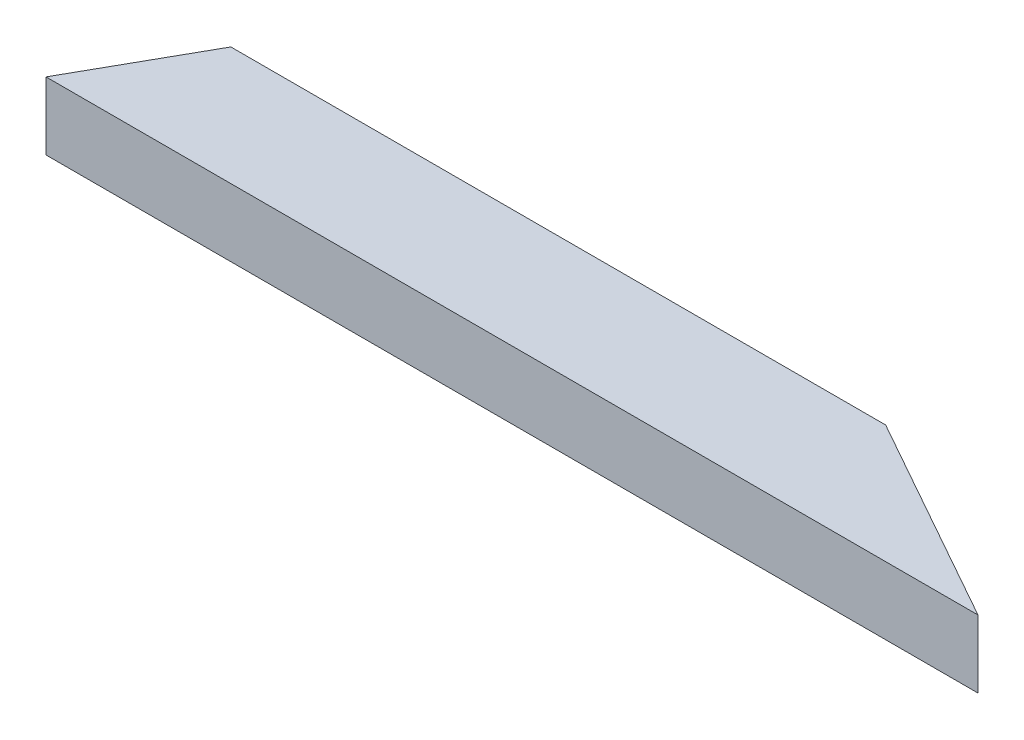
ISO-10303-21;
HEADER;
FILE_DESCRIPTION(('STEP AP214'),'2;1');
FILE_NAME('part.step','',(''),(''),'','','');
FILE_SCHEMA(('AUTOMOTIVE_DESIGN { 1 0 10303 214 1 1 1 1 }'));
ENDSEC;
DATA;
#1=APPLICATION_CONTEXT('core data for automotive mechanical design processes');
#2=APPLICATION_PROTOCOL_DEFINITION('international standard','automotive_design',2000,#1);
#3=PRODUCT_CONTEXT('',#1,'mechanical');
#4=PRODUCT('Part','Part','',(#3));
#5=PRODUCT_RELATED_PRODUCT_CATEGORY('part','',(#4));
#6=PRODUCT_DEFINITION_FORMATION('','',#4);
#7=PRODUCT_DEFINITION_CONTEXT('part definition',#1,'design');
#8=PRODUCT_DEFINITION('design','',#6,#7);
#9=PRODUCT_DEFINITION_SHAPE('','',#8);
#10=(LENGTH_UNIT() NAMED_UNIT(*) SI_UNIT(.MILLI.,.METRE.));
#11=(NAMED_UNIT(*) PLANE_ANGLE_UNIT() SI_UNIT($,.RADIAN.));
#12=(NAMED_UNIT(*) SI_UNIT($,.STERADIAN.) SOLID_ANGLE_UNIT());
#13=UNCERTAINTY_MEASURE_WITH_UNIT(LENGTH_MEASURE(1.E-05),#10,'distance_accuracy_value','');
#14=(GEOMETRIC_REPRESENTATION_CONTEXT(3) GLOBAL_UNCERTAINTY_ASSIGNED_CONTEXT((#13)) GLOBAL_UNIT_ASSIGNED_CONTEXT((#10,
#11,#12)) REPRESENTATION_CONTEXT('',''));
#15=CARTESIAN_POINT('',(0.,0.,0.));
#16=DIRECTION('',(0.,0.,1.));
#17=DIRECTION('',(1.,0.,0.));
#18=AXIS2_PLACEMENT_3D('',#15,#16,#17);
#19=CARTESIAN_POINT('',(49.9390162627724,50.8,-88.9));
#20=DIRECTION('',(0.871857142863846,0.,0.489760270374487));
#21=DIRECTION('',(0.489760270374487,0.,-0.871857142863846));
#22=AXIS2_PLACEMENT_3D('',#19,#20,#21);
#23=PLANE('',#22);
#24=DIRECTION('',(-0.489760270374487,0.,0.871857142863846));
#25=VECTOR('',#24,1.);
#26=CARTESIAN_POINT('',(49.9390162627724,0.,-88.9));
#27=LINE('',#26,#25);
#28=CARTESIAN_POINT('',(49.9390162627724,0.,-88.9));
#29=VERTEX_POINT('',#28);
#30=CARTESIAN_POINT('',(0.,0.,0.));
#31=VERTEX_POINT('',#30);
#32=EDGE_CURVE('E96',#29,#31,#27,.T.);
#33=ORIENTED_EDGE('',*,*,#32,.T.);
#34=DIRECTION('',(0.,-1.,0.));
#35=VECTOR('',#34,1.);
#36=CARTESIAN_POINT('',(0.,50.8,0.));
#37=LINE('',#36,#35);
#38=CARTESIAN_POINT('',(0.,50.8,0.));
#39=VERTEX_POINT('',#38);
#40=EDGE_CURVE('E11',#39,#31,#37,.T.);
#41=ORIENTED_EDGE('',*,*,#40,.F.);
#42=DIRECTION('',(-0.489760270374487,0.,0.871857142863846));
#43=VECTOR('',#42,1.);
#44=CARTESIAN_POINT('',(49.9390162627724,50.8,-88.9));
#45=LINE('',#44,#43);
#46=CARTESIAN_POINT('',(49.9390162627724,50.8,-88.9));
#47=VERTEX_POINT('',#46);
#48=EDGE_CURVE('E84',#47,#39,#45,.T.);
#49=ORIENTED_EDGE('',*,*,#48,.F.);
#50=DIRECTION('',(0.,-1.,0.));
#51=VECTOR('',#50,1.);
#52=CARTESIAN_POINT('',(49.9390162627724,50.8,-88.9));
#53=LINE('',#52,#51);
#54=EDGE_CURVE('E92',#47,#29,#53,.T.);
#55=ORIENTED_EDGE('',*,*,#54,.T.);
#56=EDGE_LOOP('',(#33,#41,#49,#55));
#57=FACE_BOUND('',#56,.T.);
#58=ADVANCED_FACE('F33',(#57),#23,.F.);
#59=CARTESIAN_POINT('',(0.,50.8,0.));
#60=DIRECTION('',(0.,0.,-1.));
#61=DIRECTION('',(-1.,0.,0.));
#62=AXIS2_PLACEMENT_3D('',#59,#60,#61);
#63=PLANE('',#62);
#64=DIRECTION('',(1.,0.,0.));
#65=VECTOR('',#64,1.);
#66=CARTESIAN_POINT('',(0.,0.,0.));
#67=LINE('',#66,#65);
#68=CARTESIAN_POINT('',(700.,0.,0.));
#69=VERTEX_POINT('',#68);
#70=EDGE_CURVE('E88',#31,#69,#67,.T.);
#71=ORIENTED_EDGE('',*,*,#70,.T.);
#72=DIRECTION('',(0.,-1.,0.));
#73=VECTOR('',#72,1.);
#74=CARTESIAN_POINT('',(700.,50.8,0.));
#75=LINE('',#74,#73);
#76=CARTESIAN_POINT('',(700.,50.8,0.));
#77=VERTEX_POINT('',#76);
#78=EDGE_CURVE('E41',#77,#69,#75,.T.);
#79=ORIENTED_EDGE('',*,*,#78,.F.);
#80=DIRECTION('',(1.,0.,0.));
#81=VECTOR('',#80,1.);
#82=CARTESIAN_POINT('',(0.,50.8,0.));
#83=LINE('',#82,#81);
#84=EDGE_CURVE('E79',#39,#77,#83,.T.);
#85=ORIENTED_EDGE('',*,*,#84,.F.);
#86=ORIENTED_EDGE('',*,*,#40,.T.);
#87=EDGE_LOOP('',(#71,#79,#85,#86));
#88=FACE_BOUND('',#87,.T.);
#89=ADVANCED_FACE('F87',(#88),#63,.F.);
#90=CARTESIAN_POINT('',(700.,50.8,0.));
#91=DIRECTION('',(-0.489760270374487,0.,0.871857142863846));
#92=DIRECTION('',(0.871857142863846,0.,0.489760270374487));
#93=AXIS2_PLACEMENT_3D('',#90,#91,#92);
#94=PLANE('',#93);
#95=DIRECTION('',(-0.871857142863846,0.,-0.489760270374487));
#96=VECTOR('',#95,1.);
#97=CARTESIAN_POINT('',(700.,0.,0.));
#98=LINE('',#97,#96);
#99=CARTESIAN_POINT('',(541.742777662772,0.,-88.9));
#100=VERTEX_POINT('',#99);
#101=EDGE_CURVE('E66',#69,#100,#98,.T.);
#102=ORIENTED_EDGE('',*,*,#101,.T.);
#103=DIRECTION('',(0.,-1.,0.));
#104=VECTOR('',#103,1.);
#105=CARTESIAN_POINT('',(541.742777662772,50.8,-88.9));
#106=LINE('',#105,#104);
#107=CARTESIAN_POINT('',(541.742777662772,50.8,-88.9));
#108=VERTEX_POINT('',#107);
#109=EDGE_CURVE('E89',#108,#100,#106,.T.);
#110=ORIENTED_EDGE('',*,*,#109,.F.);
#111=DIRECTION('',(-0.871857142863846,0.,-0.489760270374487));
#112=VECTOR('',#111,1.);
#113=CARTESIAN_POINT('',(700.,50.8,0.));
#114=LINE('',#113,#112);
#115=EDGE_CURVE('E82',#77,#108,#114,.T.);
#116=ORIENTED_EDGE('',*,*,#115,.F.);
#117=ORIENTED_EDGE('',*,*,#78,.T.);
#118=EDGE_LOOP('',(#102,#110,#116,#117));
#119=FACE_BOUND('',#118,.T.);
#120=ADVANCED_FACE('F90',(#119),#94,.F.);
#121=CARTESIAN_POINT('',(541.742777662772,50.8,-88.9));
#122=DIRECTION('',(0.,0.,1.));
#123=DIRECTION('',(1.,0.,0.));
#124=AXIS2_PLACEMENT_3D('',#121,#122,#123);
#125=PLANE('',#124);
#126=DIRECTION('',(-1.,0.,0.));
#127=VECTOR('',#126,1.);
#128=CARTESIAN_POINT('',(541.742777662772,0.,-88.9));
#129=LINE('',#128,#127);
#130=EDGE_CURVE('E72',#100,#29,#129,.T.);
#131=ORIENTED_EDGE('',*,*,#130,.T.);
#132=ORIENTED_EDGE('',*,*,#54,.F.);
#133=DIRECTION('',(-1.,0.,0.));
#134=VECTOR('',#133,1.);
#135=CARTESIAN_POINT('',(541.742777662772,50.8,-88.9));
#136=LINE('',#135,#134);
#137=EDGE_CURVE('E49',#108,#47,#136,.T.);
#138=ORIENTED_EDGE('',*,*,#137,.F.);
#139=ORIENTED_EDGE('',*,*,#109,.T.);
#140=EDGE_LOOP('',(#131,#132,#138,#139));
#141=FACE_BOUND('',#140,.T.);
#142=ADVANCED_FACE('F103',(#141),#125,.F.);
#143=CARTESIAN_POINT('',(0.,50.8,0.));
#144=DIRECTION('',(0.,-1.,0.));
#145=DIRECTION('',(0.,0.,-1.));
#146=AXIS2_PLACEMENT_3D('',#143,#144,#145);
#147=PLANE('',#146);
#148=ORIENTED_EDGE('',*,*,#48,.T.);
#149=ORIENTED_EDGE('',*,*,#84,.T.);
#150=ORIENTED_EDGE('',*,*,#115,.T.);
#151=ORIENTED_EDGE('',*,*,#137,.T.);
#152=EDGE_LOOP('',(#148,#149,#150,#151));
#153=FACE_BOUND('',#152,.T.);
#154=ADVANCED_FACE('F80',(#153),#147,.F.);
#155=CARTESIAN_POINT('',(0.,0.,0.));
#156=DIRECTION('',(0.,-1.,0.));
#157=DIRECTION('',(0.,0.,-1.));
#158=AXIS2_PLACEMENT_3D('',#155,#156,#157);
#159=PLANE('',#158);
#160=ORIENTED_EDGE('',*,*,#32,.F.);
#161=ORIENTED_EDGE('',*,*,#130,.F.);
#162=ORIENTED_EDGE('',*,*,#101,.F.);
#163=ORIENTED_EDGE('',*,*,#70,.F.);
#164=EDGE_LOOP('',(#160,#161,#162,#163));
#165=FACE_BOUND('',#164,.T.);
#166=ADVANCED_FACE('F106',(#165),#159,.T.);
#167=CLOSED_SHELL('',(#58,#89,#120,#142,#154,#166));
#168=MANIFOLD_SOLID_BREP('B2',#167);
#169=ADVANCED_BREP_SHAPE_REPRESENTATION('',(#18,#168),#14);
#170=SHAPE_DEFINITION_REPRESENTATION(#9,#169);
ENDSEC;
END-ISO-10303-21;
